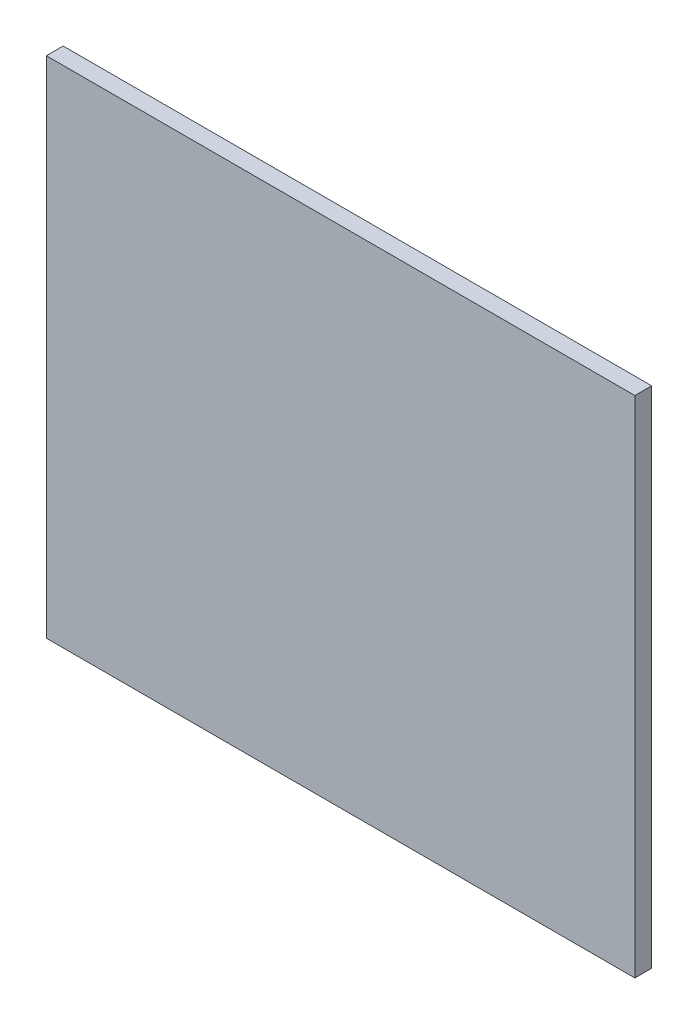
ISO-10303-21;
HEADER;
FILE_DESCRIPTION(('STEP AP214'),'2;1');
FILE_NAME('part.step','',(''),(''),'','','');
FILE_SCHEMA(('AUTOMOTIVE_DESIGN { 1 0 10303 214 1 1 1 1 }'));
ENDSEC;
DATA;
#1=APPLICATION_CONTEXT('core data for automotive mechanical design processes');
#2=APPLICATION_PROTOCOL_DEFINITION('international standard','automotive_design',2000,#1);
#3=PRODUCT_CONTEXT('',#1,'mechanical');
#4=PRODUCT('Part','Part','',(#3));
#5=PRODUCT_RELATED_PRODUCT_CATEGORY('part','',(#4));
#6=PRODUCT_DEFINITION_FORMATION('','',#4);
#7=PRODUCT_DEFINITION_CONTEXT('part definition',#1,'design');
#8=PRODUCT_DEFINITION('design','',#6,#7);
#9=PRODUCT_DEFINITION_SHAPE('','',#8);
#10=(LENGTH_UNIT() NAMED_UNIT(*) SI_UNIT(.MILLI.,.METRE.));
#11=(NAMED_UNIT(*) PLANE_ANGLE_UNIT() SI_UNIT($,.RADIAN.));
#12=(NAMED_UNIT(*) SI_UNIT($,.STERADIAN.) SOLID_ANGLE_UNIT());
#13=UNCERTAINTY_MEASURE_WITH_UNIT(LENGTH_MEASURE(1.E-05),#10,'distance_accuracy_value','');
#14=(GEOMETRIC_REPRESENTATION_CONTEXT(3) GLOBAL_UNCERTAINTY_ASSIGNED_CONTEXT((#13)) GLOBAL_UNIT_ASSIGNED_CONTEXT((#10,
#11,#12)) REPRESENTATION_CONTEXT('',''));
#15=CARTESIAN_POINT('',(0.,0.,0.));
#16=DIRECTION('',(0.,0.,1.));
#17=DIRECTION('',(1.,0.,0.));
#18=AXIS2_PLACEMENT_3D('',#15,#16,#17);
#19=CARTESIAN_POINT('',(350.,-300.,20.));
#20=DIRECTION('',(-1.,0.,0.));
#21=DIRECTION('',(0.,0.,1.));
#22=AXIS2_PLACEMENT_3D('',#19,#20,#21);
#23=PLANE('',#22);
#24=DIRECTION('',(0.,1.,0.));
#25=VECTOR('',#24,1.);
#26=CARTESIAN_POINT('',(350.,-300.,0.));
#27=LINE('',#26,#25);
#28=CARTESIAN_POINT('',(350.,-300.,0.));
#29=VERTEX_POINT('',#28);
#30=CARTESIAN_POINT('',(350.,300.,0.));
#31=VERTEX_POINT('',#30);
#32=EDGE_CURVE('E113',#29,#31,#27,.T.);
#33=ORIENTED_EDGE('',*,*,#32,.T.);
#34=DIRECTION('',(0.,0.,-1.));
#35=VECTOR('',#34,1.);
#36=CARTESIAN_POINT('',(350.,300.,20.));
#37=LINE('',#36,#35);
#38=CARTESIAN_POINT('',(350.,300.,20.));
#39=VERTEX_POINT('',#38);
#40=EDGE_CURVE('E11',#39,#31,#37,.T.);
#41=ORIENTED_EDGE('',*,*,#40,.F.);
#42=DIRECTION('',(0.,1.,0.));
#43=VECTOR('',#42,1.);
#44=CARTESIAN_POINT('',(350.,-300.,20.));
#45=LINE('',#44,#43);
#46=CARTESIAN_POINT('',(350.,-300.,20.));
#47=VERTEX_POINT('',#46);
#48=EDGE_CURVE('E97',#47,#39,#45,.T.);
#49=ORIENTED_EDGE('',*,*,#48,.F.);
#50=DIRECTION('',(0.,0.,-1.));
#51=VECTOR('',#50,1.);
#52=CARTESIAN_POINT('',(350.,-300.,20.));
#53=LINE('',#52,#51);
#54=EDGE_CURVE('E109',#47,#29,#53,.T.);
#55=ORIENTED_EDGE('',*,*,#54,.T.);
#56=EDGE_LOOP('',(#33,#41,#49,#55));
#57=FACE_BOUND('',#56,.T.);
#58=ADVANCED_FACE('F45',(#57),#23,.F.);
#59=CARTESIAN_POINT('',(-350.,300.,20.));
#60=DIRECTION('',(0.,-1.,0.));
#61=DIRECTION('',(0.,0.,-1.));
#62=AXIS2_PLACEMENT_3D('',#59,#60,#61);
#63=PLANE('',#62);
#64=DIRECTION('',(-1.,0.,0.));
#65=VECTOR('',#64,1.);
#66=CARTESIAN_POINT('',(-350.,300.,0.));
#67=LINE('',#66,#65);
#68=CARTESIAN_POINT('',(-350.,300.,0.));
#69=VERTEX_POINT('',#68);
#70=EDGE_CURVE('E102',#31,#69,#67,.T.);
#71=ORIENTED_EDGE('',*,*,#70,.T.);
#72=DIRECTION('',(0.,0.,-1.));
#73=VECTOR('',#72,1.);
#74=CARTESIAN_POINT('',(-350.,300.,20.));
#75=LINE('',#74,#73);
#76=CARTESIAN_POINT('',(-350.,300.,20.));
#77=VERTEX_POINT('',#76);
#78=EDGE_CURVE('E54',#77,#69,#75,.T.);
#79=ORIENTED_EDGE('',*,*,#78,.F.);
#80=DIRECTION('',(-1.,0.,0.));
#81=VECTOR('',#80,1.);
#82=CARTESIAN_POINT('',(-350.,300.,20.));
#83=LINE('',#82,#81);
#84=EDGE_CURVE('E92',#39,#77,#83,.T.);
#85=ORIENTED_EDGE('',*,*,#84,.F.);
#86=ORIENTED_EDGE('',*,*,#40,.T.);
#87=EDGE_LOOP('',(#71,#79,#85,#86));
#88=FACE_BOUND('',#87,.T.);
#89=ADVANCED_FACE('F101',(#88),#63,.F.);
#90=CARTESIAN_POINT('',(-350.,-300.,20.));
#91=DIRECTION('',(1.,0.,0.));
#92=DIRECTION('',(0.,0.,-1.));
#93=AXIS2_PLACEMENT_3D('',#90,#91,#92);
#94=PLANE('',#93);
#95=DIRECTION('',(0.,-1.,0.));
#96=VECTOR('',#95,1.);
#97=CARTESIAN_POINT('',(-350.,-300.,0.));
#98=LINE('',#97,#96);
#99=CARTESIAN_POINT('',(-350.,-300.,0.));
#100=VERTEX_POINT('',#99);
#101=EDGE_CURVE('E79',#69,#100,#98,.T.);
#102=ORIENTED_EDGE('',*,*,#101,.T.);
#103=DIRECTION('',(0.,0.,-1.));
#104=VECTOR('',#103,1.);
#105=CARTESIAN_POINT('',(-350.,-300.,20.));
#106=LINE('',#105,#104);
#107=CARTESIAN_POINT('',(-350.,-300.,20.));
#108=VERTEX_POINT('',#107);
#109=EDGE_CURVE('E104',#108,#100,#106,.T.);
#110=ORIENTED_EDGE('',*,*,#109,.F.);
#111=DIRECTION('',(0.,-1.,0.));
#112=VECTOR('',#111,1.);
#113=CARTESIAN_POINT('',(-350.,-300.,20.));
#114=LINE('',#113,#112);
#115=EDGE_CURVE('E95',#77,#108,#114,.T.);
#116=ORIENTED_EDGE('',*,*,#115,.F.);
#117=ORIENTED_EDGE('',*,*,#78,.T.);
#118=EDGE_LOOP('',(#102,#110,#116,#117));
#119=FACE_BOUND('',#118,.T.);
#120=ADVANCED_FACE('F105',(#119),#94,.F.);
#121=CARTESIAN_POINT('',(-350.,-300.,20.));
#122=DIRECTION('',(0.,1.,0.));
#123=DIRECTION('',(0.,0.,1.));
#124=AXIS2_PLACEMENT_3D('',#121,#122,#123);
#125=PLANE('',#124);
#126=DIRECTION('',(1.,0.,0.));
#127=VECTOR('',#126,1.);
#128=CARTESIAN_POINT('',(-350.,-300.,0.));
#129=LINE('',#128,#127);
#130=EDGE_CURVE('E85',#100,#29,#129,.T.);
#131=ORIENTED_EDGE('',*,*,#130,.T.);
#132=ORIENTED_EDGE('',*,*,#54,.F.);
#133=DIRECTION('',(1.,0.,0.));
#134=VECTOR('',#133,1.);
#135=CARTESIAN_POINT('',(-350.,-300.,20.));
#136=LINE('',#135,#134);
#137=EDGE_CURVE('E62',#108,#47,#136,.T.);
#138=ORIENTED_EDGE('',*,*,#137,.F.);
#139=ORIENTED_EDGE('',*,*,#109,.T.);
#140=EDGE_LOOP('',(#131,#132,#138,#139));
#141=FACE_BOUND('',#140,.T.);
#142=ADVANCED_FACE('F126',(#141),#125,.F.);
#143=CARTESIAN_POINT('',(0.,0.,20.));
#144=DIRECTION('',(0.,0.,-1.));
#145=DIRECTION('',(-1.,0.,0.));
#146=AXIS2_PLACEMENT_3D('',#143,#144,#145);
#147=PLANE('',#146);
#148=ORIENTED_EDGE('',*,*,#48,.T.);
#149=ORIENTED_EDGE('',*,*,#84,.T.);
#150=ORIENTED_EDGE('',*,*,#115,.T.);
#151=ORIENTED_EDGE('',*,*,#137,.T.);
#152=EDGE_LOOP('',(#148,#149,#150,#151));
#153=FACE_BOUND('',#152,.T.);
#154=ADVANCED_FACE('F93',(#153),#147,.F.);
#155=CARTESIAN_POINT('',(0.,0.,0.));
#156=DIRECTION('',(0.,0.,-1.));
#157=DIRECTION('',(-1.,0.,0.));
#158=AXIS2_PLACEMENT_3D('',#155,#156,#157);
#159=PLANE('',#158);
#160=ORIENTED_EDGE('',*,*,#32,.F.);
#161=ORIENTED_EDGE('',*,*,#130,.F.);
#162=ORIENTED_EDGE('',*,*,#101,.F.);
#163=ORIENTED_EDGE('',*,*,#70,.F.);
#164=EDGE_LOOP('',(#160,#161,#162,#163));
#165=FACE_BOUND('',#164,.T.);
#166=ADVANCED_FACE('F129',(#165),#159,.T.);
#167=CLOSED_SHELL('',(#58,#89,#120,#142,#154,#166));
#168=MANIFOLD_SOLID_BREP('B2',#167);
#169=ADVANCED_BREP_SHAPE_REPRESENTATION('',(#18,#168),#14);
#170=SHAPE_DEFINITION_REPRESENTATION(#9,#169);
ENDSEC;
END-ISO-10303-21;
